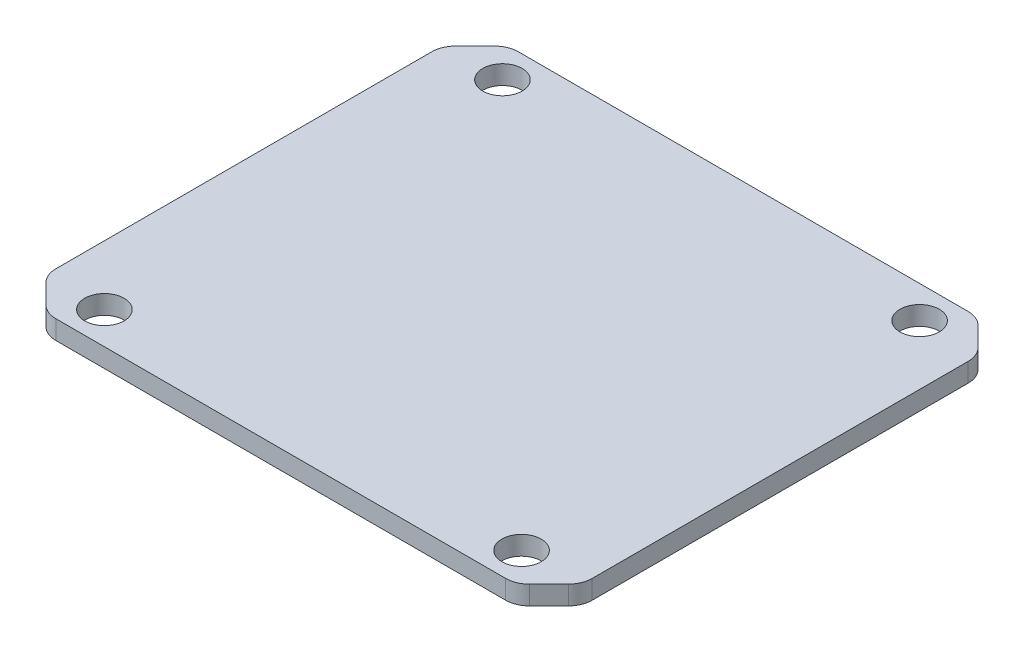
ISO-10303-21;
HEADER;
FILE_DESCRIPTION(('STEP AP214'),'2;1');
FILE_NAME('part.step','',(''),(''),'','','');
FILE_SCHEMA(('AUTOMOTIVE_DESIGN { 1 0 10303 214 1 1 1 1 }'));
ENDSEC;
DATA;
#1=APPLICATION_CONTEXT('core data for automotive mechanical design processes');
#2=APPLICATION_PROTOCOL_DEFINITION('international standard','automotive_design',2000,#1);
#3=PRODUCT_CONTEXT('',#1,'mechanical');
#4=PRODUCT('Part','Part','',(#3));
#5=PRODUCT_RELATED_PRODUCT_CATEGORY('part','',(#4));
#6=PRODUCT_DEFINITION_FORMATION('','',#4);
#7=PRODUCT_DEFINITION_CONTEXT('part definition',#1,'design');
#8=PRODUCT_DEFINITION('design','',#6,#7);
#9=PRODUCT_DEFINITION_SHAPE('','',#8);
#10=(LENGTH_UNIT() NAMED_UNIT(*) SI_UNIT(.MILLI.,.METRE.));
#11=(NAMED_UNIT(*) PLANE_ANGLE_UNIT() SI_UNIT($,.RADIAN.));
#12=(NAMED_UNIT(*) SI_UNIT($,.STERADIAN.) SOLID_ANGLE_UNIT());
#13=UNCERTAINTY_MEASURE_WITH_UNIT(LENGTH_MEASURE(1.E-05),#10,'distance_accuracy_value','');
#14=(GEOMETRIC_REPRESENTATION_CONTEXT(3) GLOBAL_UNCERTAINTY_ASSIGNED_CONTEXT((#13)) GLOBAL_UNIT_ASSIGNED_CONTEXT((#10,
#11,#12)) REPRESENTATION_CONTEXT('',''));
#15=CARTESIAN_POINT('',(0.,0.,0.));
#16=DIRECTION('',(0.,0.,1.));
#17=DIRECTION('',(1.,0.,0.));
#18=AXIS2_PLACEMENT_3D('',#15,#16,#17);
#19=CARTESIAN_POINT('',(22.5,0.79375,19.4));
#20=DIRECTION('',(-1.,0.,0.));
#21=DIRECTION('',(0.,0.,1.));
#22=AXIS2_PLACEMENT_3D('',#19,#20,#21);
#23=PLANE('',#22);
#24=DIRECTION('',(0.,0.,-1.));
#25=VECTOR('',#24,1.);
#26=CARTESIAN_POINT('',(22.5,-0.79375,19.4));
#27=LINE('',#26,#25);
#28=CARTESIAN_POINT('',(22.5,-0.79375,15.7715728752538));
#29=VERTEX_POINT('',#28);
#30=CARTESIAN_POINT('',(22.5,-0.79375,-15.7715728752538));
#31=VERTEX_POINT('',#30);
#32=EDGE_CURVE('E187',#29,#31,#27,.T.);
#33=ORIENTED_EDGE('',*,*,#32,.T.);
#34=DIRECTION('',(0.,-1.,0.));
#35=VECTOR('',#34,1.);
#36=CARTESIAN_POINT('',(22.5,0.79375,-15.7715728752538));
#37=LINE('',#36,#35);
#38=CARTESIAN_POINT('',(22.5,0.79375,-15.7715728752538));
#39=VERTEX_POINT('',#38);
#40=EDGE_CURVE('E253',#31,#39,#37,.F.);
#41=ORIENTED_EDGE('',*,*,#40,.T.);
#42=DIRECTION('',(0.,0.,-1.));
#43=VECTOR('',#42,1.);
#44=CARTESIAN_POINT('',(22.5,0.79375,19.4));
#45=LINE('',#44,#43);
#46=CARTESIAN_POINT('',(22.5,0.79375,15.7715728752538));
#47=VERTEX_POINT('',#46);
#48=EDGE_CURVE('E184',#47,#39,#45,.T.);
#49=ORIENTED_EDGE('',*,*,#48,.F.);
#50=DIRECTION('',(0.,1.,0.));
#51=VECTOR('',#50,1.);
#52=CARTESIAN_POINT('',(22.5,-0.79375,15.7715728752538));
#53=LINE('',#52,#51);
#54=EDGE_CURVE('E250',#47,#29,#53,.F.);
#55=ORIENTED_EDGE('',*,*,#54,.T.);
#56=EDGE_LOOP('',(#33,#41,#49,#55));
#57=FACE_BOUND('',#56,.T.);
#58=ADVANCED_FACE('F36',(#57),#23,.F.);
#59=CARTESIAN_POINT('',(-22.5,0.79375,-19.4));
#60=DIRECTION('',(0.,0.,1.));
#61=DIRECTION('',(1.,0.,0.));
#62=AXIS2_PLACEMENT_3D('',#59,#60,#61);
#63=PLANE('',#62);
#64=DIRECTION('',(-1.,0.,0.));
#65=VECTOR('',#64,1.);
#66=CARTESIAN_POINT('',(-22.5,-0.79375,-19.4));
#67=LINE('',#66,#65);
#68=CARTESIAN_POINT('',(18.8715728752538,-0.79375,-19.4));
#69=VERTEX_POINT('',#68);
#70=CARTESIAN_POINT('',(-18.8715728752538,-0.79375,-19.4));
#71=VERTEX_POINT('',#70);
#72=EDGE_CURVE('E181',#69,#71,#67,.T.);
#73=ORIENTED_EDGE('',*,*,#72,.T.);
#74=DIRECTION('',(0.,-1.,0.));
#75=VECTOR('',#74,1.);
#76=CARTESIAN_POINT('',(-18.8715728752538,0.79375,-19.4));
#77=LINE('',#76,#75);
#78=CARTESIAN_POINT('',(-18.8715728752538,0.79375,-19.4));
#79=VERTEX_POINT('',#78);
#80=EDGE_CURVE('E244',#71,#79,#77,.F.);
#81=ORIENTED_EDGE('',*,*,#80,.T.);
#82=DIRECTION('',(-1.,0.,0.));
#83=VECTOR('',#82,1.);
#84=CARTESIAN_POINT('',(-22.5,0.79375,-19.4));
#85=LINE('',#84,#83);
#86=CARTESIAN_POINT('',(18.8715728752538,0.79375,-19.4));
#87=VERTEX_POINT('',#86);
#88=EDGE_CURVE('E288',#87,#79,#85,.T.);
#89=ORIENTED_EDGE('',*,*,#88,.F.);
#90=DIRECTION('',(0.,1.,0.));
#91=VECTOR('',#90,1.);
#92=CARTESIAN_POINT('',(18.8715728752538,-0.79375,-19.4));
#93=LINE('',#92,#91);
#94=EDGE_CURVE('E241',#87,#69,#93,.F.);
#95=ORIENTED_EDGE('',*,*,#94,.T.);
#96=EDGE_LOOP('',(#73,#81,#89,#95));
#97=FACE_BOUND('',#96,.T.);
#98=ADVANCED_FACE('F310',(#97),#63,.F.);
#99=CARTESIAN_POINT('',(-22.5,0.79375,19.4));
#100=DIRECTION('',(1.,0.,0.));
#101=DIRECTION('',(0.,0.,-1.));
#102=AXIS2_PLACEMENT_3D('',#99,#100,#101);
#103=PLANE('',#102);
#104=DIRECTION('',(0.,0.,1.));
#105=VECTOR('',#104,1.);
#106=CARTESIAN_POINT('',(-22.5,0.79375,19.4));
#107=LINE('',#106,#105);
#108=CARTESIAN_POINT('',(-22.5,0.79375,-15.7715728752538));
#109=VERTEX_POINT('',#108);
#110=CARTESIAN_POINT('',(-22.5,0.79375,15.7715728752538));
#111=VERTEX_POINT('',#110);
#112=EDGE_CURVE('E172',#109,#111,#107,.T.);
#113=ORIENTED_EDGE('',*,*,#112,.F.);
#114=DIRECTION('',(0.,1.,0.));
#115=VECTOR('',#114,1.);
#116=CARTESIAN_POINT('',(-22.5,-0.79375,-15.7715728752538));
#117=LINE('',#116,#115);
#118=CARTESIAN_POINT('',(-22.5,-0.79375,-15.7715728752538));
#119=VERTEX_POINT('',#118);
#120=EDGE_CURVE('E155',#109,#119,#117,.F.);
#121=ORIENTED_EDGE('',*,*,#120,.T.);
#122=DIRECTION('',(0.,0.,1.));
#123=VECTOR('',#122,1.);
#124=CARTESIAN_POINT('',(-22.5,-0.79375,19.4));
#125=LINE('',#124,#123);
#126=CARTESIAN_POINT('',(-22.5,-0.79375,15.7715728752538));
#127=VERTEX_POINT('',#126);
#128=EDGE_CURVE('E169',#119,#127,#125,.T.);
#129=ORIENTED_EDGE('',*,*,#128,.T.);
#130=DIRECTION('',(0.,-1.,0.));
#131=VECTOR('',#130,1.);
#132=CARTESIAN_POINT('',(-22.5,0.79375,15.7715728752538));
#133=LINE('',#132,#131);
#134=EDGE_CURVE('E174',#127,#111,#133,.F.);
#135=ORIENTED_EDGE('',*,*,#134,.T.);
#136=EDGE_LOOP('',(#113,#121,#129,#135));
#137=FACE_BOUND('',#136,.T.);
#138=ADVANCED_FACE('F167',(#137),#103,.F.);
#139=CARTESIAN_POINT('',(-22.5,0.79375,19.4));
#140=DIRECTION('',(0.,0.,-1.));
#141=DIRECTION('',(-1.,0.,0.));
#142=AXIS2_PLACEMENT_3D('',#139,#140,#141);
#143=PLANE('',#142);
#144=DIRECTION('',(1.,0.,0.));
#145=VECTOR('',#144,1.);
#146=CARTESIAN_POINT('',(-22.5,-0.79375,19.4));
#147=LINE('',#146,#145);
#148=CARTESIAN_POINT('',(-18.8715728752538,-0.79375,19.4));
#149=VERTEX_POINT('',#148);
#150=CARTESIAN_POINT('',(18.8715728752538,-0.79375,19.4));
#151=VERTEX_POINT('',#150);
#152=EDGE_CURVE('E180',#149,#151,#147,.T.);
#153=ORIENTED_EDGE('',*,*,#152,.T.);
#154=DIRECTION('',(0.,-1.,0.));
#155=VECTOR('',#154,1.);
#156=CARTESIAN_POINT('',(18.8715728752538,0.79375,19.4));
#157=LINE('',#156,#155);
#158=CARTESIAN_POINT('',(18.8715728752538,0.79375,19.4));
#159=VERTEX_POINT('',#158);
#160=EDGE_CURVE('E263',#151,#159,#157,.F.);
#161=ORIENTED_EDGE('',*,*,#160,.T.);
#162=DIRECTION('',(1.,0.,0.));
#163=VECTOR('',#162,1.);
#164=CARTESIAN_POINT('',(-22.5,0.79375,19.4));
#165=LINE('',#164,#163);
#166=CARTESIAN_POINT('',(-18.8715728752538,0.79375,19.4));
#167=VERTEX_POINT('',#166);
#168=EDGE_CURVE('E195',#167,#159,#165,.T.);
#169=ORIENTED_EDGE('',*,*,#168,.F.);
#170=DIRECTION('',(0.,1.,0.));
#171=VECTOR('',#170,1.);
#172=CARTESIAN_POINT('',(-18.8715728752538,-0.79375,19.4));
#173=LINE('',#172,#171);
#174=EDGE_CURVE('E260',#167,#149,#173,.F.);
#175=ORIENTED_EDGE('',*,*,#174,.T.);
#176=EDGE_LOOP('',(#153,#161,#169,#175));
#177=FACE_BOUND('',#176,.T.);
#178=ADVANCED_FACE('F279',(#177),#143,.F.);
#179=CARTESIAN_POINT('',(0.,0.79375,0.));
#180=DIRECTION('',(0.,-1.,0.));
#181=DIRECTION('',(0.,0.,-1.));
#182=AXIS2_PLACEMENT_3D('',#179,#180,#181);
#183=PLANE('',#182);
#184=CARTESIAN_POINT('',(-17.5,0.79375,16.7));
#185=DIRECTION('',(0.,-1.,0.));
#186=DIRECTION('',(0.,0.,-1.));
#187=AXIS2_PLACEMENT_3D('',#184,#185,#186);
#188=CIRCLE('',#187,1.65);
#189=CARTESIAN_POINT('',(-17.5,0.79375,15.05));
#190=VERTEX_POINT('',#189);
#191=EDGE_CURVE('E292',#190,#190,#188,.T.);
#192=ORIENTED_EDGE('',*,*,#191,.T.);
#193=EDGE_LOOP('',(#192));
#194=FACE_BOUND('',#193,.T.);
#195=CARTESIAN_POINT('',(17.5,0.79375,16.7));
#196=DIRECTION('',(0.,-1.,0.));
#197=DIRECTION('',(0.,0.,-1.));
#198=AXIS2_PLACEMENT_3D('',#195,#196,#197);
#199=CIRCLE('',#198,1.65);
#200=CARTESIAN_POINT('',(17.5,0.79375,15.05));
#201=VERTEX_POINT('',#200);
#202=EDGE_CURVE('E297',#201,#201,#199,.T.);
#203=ORIENTED_EDGE('',*,*,#202,.T.);
#204=EDGE_LOOP('',(#203));
#205=FACE_BOUND('',#204,.T.);
#206=CARTESIAN_POINT('',(17.5,0.79375,-16.7));
#207=DIRECTION('',(0.,-1.,0.));
#208=DIRECTION('',(0.,0.,-1.));
#209=AXIS2_PLACEMENT_3D('',#206,#207,#208);
#210=CIRCLE('',#209,1.65);
#211=CARTESIAN_POINT('',(17.5,0.79375,-18.35));
#212=VERTEX_POINT('',#211);
#213=EDGE_CURVE('E302',#212,#212,#210,.T.);
#214=ORIENTED_EDGE('',*,*,#213,.T.);
#215=EDGE_LOOP('',(#214));
#216=FACE_BOUND('',#215,.T.);
#217=CARTESIAN_POINT('',(-17.5,0.79375,-16.7));
#218=DIRECTION('',(0.,-1.,0.));
#219=DIRECTION('',(0.,0.,-1.));
#220=AXIS2_PLACEMENT_3D('',#217,#218,#219);
#221=CIRCLE('',#220,1.65);
#222=CARTESIAN_POINT('',(-17.5,0.79375,-18.35));
#223=VERTEX_POINT('',#222);
#224=EDGE_CURVE('E538',#223,#223,#221,.T.);
#225=ORIENTED_EDGE('',*,*,#224,.T.);
#226=EDGE_LOOP('',(#225));
#227=FACE_BOUND('',#226,.T.);
#228=DIRECTION('',(0.707106781186548,0.,-0.707106781186547));
#229=VECTOR('',#228,1.);
#230=CARTESIAN_POINT('',(-22.5,0.79375,-16.6));
#231=LINE('',#230,#229);
#232=CARTESIAN_POINT('',(-20.2857864376269,0.79375,-18.8142135623731));
#233=VERTEX_POINT('',#232);
#234=CARTESIAN_POINT('',(-21.9142135623731,0.79375,-17.1857864376269));
#235=VERTEX_POINT('',#234);
#236=EDGE_CURVE('E207',#233,#235,#231,.F.);
#237=ORIENTED_EDGE('',*,*,#236,.T.);
#238=CARTESIAN_POINT('',(-20.5,0.79375,-15.7715728752538));
#239=DIRECTION('',(0.,-1.,0.));
#240=DIRECTION('',(0.,0.,-1.));
#241=AXIS2_PLACEMENT_3D('',#238,#239,#240);
#242=CIRCLE('',#241,2.);
#243=EDGE_CURVE('E239',#235,#109,#242,.F.);
#244=ORIENTED_EDGE('',*,*,#243,.T.);
#245=ORIENTED_EDGE('',*,*,#112,.T.);
#246=CARTESIAN_POINT('',(-20.5,0.79375,15.7715728752538));
#247=DIRECTION('',(0.,-1.,0.));
#248=DIRECTION('',(0.,0.,-1.));
#249=AXIS2_PLACEMENT_3D('',#246,#247,#248);
#250=CIRCLE('',#249,2.);
#251=CARTESIAN_POINT('',(-21.9142135623731,0.79375,17.1857864376269));
#252=VERTEX_POINT('',#251);
#253=EDGE_CURVE('E229',#111,#252,#250,.F.);
#254=ORIENTED_EDGE('',*,*,#253,.T.);
#255=DIRECTION('',(-0.707106781186547,0.,-0.707106781186548));
#256=VECTOR('',#255,1.);
#257=CARTESIAN_POINT('',(-19.7,0.79375,19.4));
#258=LINE('',#257,#256);
#259=CARTESIAN_POINT('',(-20.2857864376269,0.79375,18.8142135623731));
#260=VERTEX_POINT('',#259);
#261=EDGE_CURVE('E210',#252,#260,#258,.F.);
#262=ORIENTED_EDGE('',*,*,#261,.T.);
#263=CARTESIAN_POINT('',(-18.8715728752538,0.79375,17.4));
#264=DIRECTION('',(0.,-1.,0.));
#265=DIRECTION('',(0.,0.,-1.));
#266=AXIS2_PLACEMENT_3D('',#263,#264,#265);
#267=CIRCLE('',#266,2.);
#268=EDGE_CURVE('E227',#260,#167,#267,.F.);
#269=ORIENTED_EDGE('',*,*,#268,.T.);
#270=ORIENTED_EDGE('',*,*,#168,.T.);
#271=CARTESIAN_POINT('',(18.8715728752538,0.79375,17.4));
#272=DIRECTION('',(0.,-1.,0.));
#273=DIRECTION('',(0.,0.,-1.));
#274=AXIS2_PLACEMENT_3D('',#271,#272,#273);
#275=CIRCLE('',#274,2.);
#276=CARTESIAN_POINT('',(20.2857864376269,0.79375,18.8142135623731));
#277=VERTEX_POINT('',#276);
#278=EDGE_CURVE('E231',#159,#277,#275,.F.);
#279=ORIENTED_EDGE('',*,*,#278,.T.);
#280=DIRECTION('',(-0.707106781186548,0.,0.707106781186547));
#281=VECTOR('',#280,1.);
#282=CARTESIAN_POINT('',(22.5,0.79375,16.6));
#283=LINE('',#282,#281);
#284=CARTESIAN_POINT('',(21.9142135623731,0.79375,17.1857864376269));
#285=VERTEX_POINT('',#284);
#286=EDGE_CURVE('E202',#277,#285,#283,.F.);
#287=ORIENTED_EDGE('',*,*,#286,.T.);
#288=CARTESIAN_POINT('',(20.5,0.79375,15.7715728752538));
#289=DIRECTION('',(0.,-1.,0.));
#290=DIRECTION('',(0.,0.,-1.));
#291=AXIS2_PLACEMENT_3D('',#288,#289,#290);
#292=CIRCLE('',#291,2.);
#293=EDGE_CURVE('E233',#285,#47,#292,.F.);
#294=ORIENTED_EDGE('',*,*,#293,.T.);
#295=ORIENTED_EDGE('',*,*,#48,.T.);
#296=CARTESIAN_POINT('',(20.5,0.79375,-15.7715728752538));
#297=DIRECTION('',(0.,-1.,0.));
#298=DIRECTION('',(0.,0.,-1.));
#299=AXIS2_PLACEMENT_3D('',#296,#297,#298);
#300=CIRCLE('',#299,2.);
#301=CARTESIAN_POINT('',(21.9142135623731,0.79375,-17.1857864376269));
#302=VERTEX_POINT('',#301);
#303=EDGE_CURVE('E235',#39,#302,#300,.F.);
#304=ORIENTED_EDGE('',*,*,#303,.T.);
#305=DIRECTION('',(0.707106781186547,0.,0.707106781186548));
#306=VECTOR('',#305,1.);
#307=CARTESIAN_POINT('',(19.7,0.79375,-19.4));
#308=LINE('',#307,#306);
#309=CARTESIAN_POINT('',(20.2857864376269,0.79375,-18.8142135623731));
#310=VERTEX_POINT('',#309);
#311=EDGE_CURVE('E205',#302,#310,#308,.F.);
#312=ORIENTED_EDGE('',*,*,#311,.T.);
#313=CARTESIAN_POINT('',(18.8715728752538,0.79375,-17.4));
#314=DIRECTION('',(0.,-1.,0.));
#315=DIRECTION('',(0.,0.,-1.));
#316=AXIS2_PLACEMENT_3D('',#313,#314,#315);
#317=CIRCLE('',#316,2.);
#318=EDGE_CURVE('E59',#310,#87,#317,.F.);
#319=ORIENTED_EDGE('',*,*,#318,.T.);
#320=ORIENTED_EDGE('',*,*,#88,.T.);
#321=CARTESIAN_POINT('',(-18.8715728752538,0.79375,-17.4));
#322=DIRECTION('',(0.,-1.,0.));
#323=DIRECTION('',(0.,0.,-1.));
#324=AXIS2_PLACEMENT_3D('',#321,#322,#323);
#325=CIRCLE('',#324,2.);
#326=EDGE_CURVE('E51',#79,#233,#325,.F.);
#327=ORIENTED_EDGE('',*,*,#326,.T.);
#328=EDGE_LOOP('',(#237,#244,#245,#254,#262,#269,#270,#279,#287,#294,#295,#304,#312,#319,#320,#327));
#329=FACE_BOUND('',#328,.T.);
#330=ADVANCED_FACE('F273',(#194,#205,#216,#227,#329),#183,.F.);
#331=CARTESIAN_POINT('',(0.,-0.79375,0.));
#332=DIRECTION('',(0.,-1.,0.));
#333=DIRECTION('',(0.,0.,-1.));
#334=AXIS2_PLACEMENT_3D('',#331,#332,#333);
#335=PLANE('',#334);
#336=CARTESIAN_POINT('',(-17.5,-0.79375,16.7));
#337=DIRECTION('',(0.,1.,0.));
#338=DIRECTION('',(0.,0.,1.));
#339=AXIS2_PLACEMENT_3D('',#336,#337,#338);
#340=CIRCLE('',#339,1.65);
#341=CARTESIAN_POINT('',(-17.5,-0.79375,18.35));
#342=VERTEX_POINT('',#341);
#343=EDGE_CURVE('E545',#342,#342,#340,.T.);
#344=ORIENTED_EDGE('',*,*,#343,.T.);
#345=EDGE_LOOP('',(#344));
#346=FACE_BOUND('',#345,.T.);
#347=CARTESIAN_POINT('',(17.5,-0.79375,16.7));
#348=DIRECTION('',(0.,1.,0.));
#349=DIRECTION('',(0.,0.,1.));
#350=AXIS2_PLACEMENT_3D('',#347,#348,#349);
#351=CIRCLE('',#350,1.65);
#352=CARTESIAN_POINT('',(17.5,-0.79375,18.35));
#353=VERTEX_POINT('',#352);
#354=EDGE_CURVE('E548',#353,#353,#351,.T.);
#355=ORIENTED_EDGE('',*,*,#354,.T.);
#356=EDGE_LOOP('',(#355));
#357=FACE_BOUND('',#356,.T.);
#358=CARTESIAN_POINT('',(17.5,-0.79375,-16.7));
#359=DIRECTION('',(0.,1.,0.));
#360=DIRECTION('',(0.,0.,1.));
#361=AXIS2_PLACEMENT_3D('',#358,#359,#360);
#362=CIRCLE('',#361,1.65);
#363=CARTESIAN_POINT('',(17.5,-0.79375,-15.05));
#364=VERTEX_POINT('',#363);
#365=EDGE_CURVE('E542',#364,#364,#362,.T.);
#366=ORIENTED_EDGE('',*,*,#365,.T.);
#367=EDGE_LOOP('',(#366));
#368=FACE_BOUND('',#367,.T.);
#369=CARTESIAN_POINT('',(-17.5,-0.79375,-16.7));
#370=DIRECTION('',(0.,1.,0.));
#371=DIRECTION('',(0.,0.,1.));
#372=AXIS2_PLACEMENT_3D('',#369,#370,#371);
#373=CIRCLE('',#372,1.65);
#374=CARTESIAN_POINT('',(-17.5,-0.79375,-15.05));
#375=VERTEX_POINT('',#374);
#376=EDGE_CURVE('E535',#375,#375,#373,.T.);
#377=ORIENTED_EDGE('',*,*,#376,.T.);
#378=EDGE_LOOP('',(#377));
#379=FACE_BOUND('',#378,.T.);
#380=ORIENTED_EDGE('',*,*,#128,.F.);
#381=CARTESIAN_POINT('',(-20.5,-0.79375,-15.7715728752538));
#382=DIRECTION('',(0.,-1.,0.));
#383=DIRECTION('',(0.,0.,-1.));
#384=AXIS2_PLACEMENT_3D('',#381,#382,#383);
#385=CIRCLE('',#384,2.);
#386=CARTESIAN_POINT('',(-21.9142135623731,-0.79375,-17.1857864376269));
#387=VERTEX_POINT('',#386);
#388=EDGE_CURVE('E151',#119,#387,#385,.T.);
#389=ORIENTED_EDGE('',*,*,#388,.T.);
#390=DIRECTION('',(-0.707106781186548,0.,0.707106781186547));
#391=VECTOR('',#390,1.);
#392=CARTESIAN_POINT('',(-19.55,-0.79375,-19.55));
#393=LINE('',#392,#391);
#394=CARTESIAN_POINT('',(-20.2857864376269,-0.79375,-18.8142135623731));
#395=VERTEX_POINT('',#394);
#396=EDGE_CURVE('E198',#387,#395,#393,.F.);
#397=ORIENTED_EDGE('',*,*,#396,.T.);
#398=CARTESIAN_POINT('',(-18.8715728752538,-0.79375,-17.4));
#399=DIRECTION('',(0.,-1.,0.));
#400=DIRECTION('',(0.,0.,-1.));
#401=AXIS2_PLACEMENT_3D('',#398,#399,#400);
#402=CIRCLE('',#401,2.);
#403=EDGE_CURVE('E162',#395,#71,#402,.T.);
#404=ORIENTED_EDGE('',*,*,#403,.T.);
#405=ORIENTED_EDGE('',*,*,#72,.F.);
#406=CARTESIAN_POINT('',(18.8715728752538,-0.79375,-17.4));
#407=DIRECTION('',(0.,-1.,0.));
#408=DIRECTION('',(0.,0.,-1.));
#409=AXIS2_PLACEMENT_3D('',#406,#407,#408);
#410=CIRCLE('',#409,2.);
#411=CARTESIAN_POINT('',(20.2857864376269,-0.79375,-18.8142135623731));
#412=VERTEX_POINT('',#411);
#413=EDGE_CURVE('E222',#69,#412,#410,.T.);
#414=ORIENTED_EDGE('',*,*,#413,.T.);
#415=DIRECTION('',(-0.707106781186547,0.,-0.707106781186548));
#416=VECTOR('',#415,1.);
#417=CARTESIAN_POINT('',(19.55,-0.79375,-19.55));
#418=LINE('',#417,#416);
#419=CARTESIAN_POINT('',(21.9142135623731,-0.79375,-17.1857864376269));
#420=VERTEX_POINT('',#419);
#421=EDGE_CURVE('E194',#412,#420,#418,.F.);
#422=ORIENTED_EDGE('',*,*,#421,.T.);
#423=CARTESIAN_POINT('',(20.5,-0.79375,-15.7715728752538));
#424=DIRECTION('',(0.,-1.,0.));
#425=DIRECTION('',(0.,0.,-1.));
#426=AXIS2_PLACEMENT_3D('',#423,#424,#425);
#427=CIRCLE('',#426,2.);
#428=EDGE_CURVE('E220',#420,#31,#427,.T.);
#429=ORIENTED_EDGE('',*,*,#428,.T.);
#430=ORIENTED_EDGE('',*,*,#32,.F.);
#431=CARTESIAN_POINT('',(20.5,-0.79375,15.7715728752538));
#432=DIRECTION('',(0.,-1.,0.));
#433=DIRECTION('',(0.,0.,-1.));
#434=AXIS2_PLACEMENT_3D('',#431,#432,#433);
#435=CIRCLE('',#434,2.);
#436=CARTESIAN_POINT('',(21.9142135623731,-0.79375,17.1857864376269));
#437=VERTEX_POINT('',#436);
#438=EDGE_CURVE('E218',#29,#437,#435,.T.);
#439=ORIENTED_EDGE('',*,*,#438,.T.);
#440=DIRECTION('',(0.707106781186548,0.,-0.707106781186547));
#441=VECTOR('',#440,1.);
#442=CARTESIAN_POINT('',(19.55,-0.79375,19.55));
#443=LINE('',#442,#441);
#444=CARTESIAN_POINT('',(20.2857864376269,-0.79375,18.8142135623731));
#445=VERTEX_POINT('',#444);
#446=EDGE_CURVE('E191',#437,#445,#443,.F.);
#447=ORIENTED_EDGE('',*,*,#446,.T.);
#448=CARTESIAN_POINT('',(18.8715728752538,-0.79375,17.4));
#449=DIRECTION('',(0.,-1.,0.));
#450=DIRECTION('',(0.,0.,-1.));
#451=AXIS2_PLACEMENT_3D('',#448,#449,#450);
#452=CIRCLE('',#451,2.);
#453=EDGE_CURVE('E216',#445,#151,#452,.T.);
#454=ORIENTED_EDGE('',*,*,#453,.T.);
#455=ORIENTED_EDGE('',*,*,#152,.F.);
#456=CARTESIAN_POINT('',(-18.8715728752538,-0.79375,17.4));
#457=DIRECTION('',(0.,-1.,0.));
#458=DIRECTION('',(0.,0.,-1.));
#459=AXIS2_PLACEMENT_3D('',#456,#457,#458);
#460=CIRCLE('',#459,2.);
#461=CARTESIAN_POINT('',(-20.2857864376269,-0.79375,18.8142135623731));
#462=VERTEX_POINT('',#461);
#463=EDGE_CURVE('E173',#149,#462,#460,.T.);
#464=ORIENTED_EDGE('',*,*,#463,.T.);
#465=DIRECTION('',(0.707106781186547,0.,0.707106781186548));
#466=VECTOR('',#465,1.);
#467=CARTESIAN_POINT('',(-19.55,-0.79375,19.55));
#468=LINE('',#467,#466);
#469=CARTESIAN_POINT('',(-21.9142135623731,-0.79375,17.1857864376269));
#470=VERTEX_POINT('',#469);
#471=EDGE_CURVE('E200',#462,#470,#468,.F.);
#472=ORIENTED_EDGE('',*,*,#471,.T.);
#473=CARTESIAN_POINT('',(-20.5,-0.79375,15.7715728752538));
#474=DIRECTION('',(0.,-1.,0.));
#475=DIRECTION('',(0.,0.,-1.));
#476=AXIS2_PLACEMENT_3D('',#473,#474,#475);
#477=CIRCLE('',#476,2.);
#478=EDGE_CURVE('E179',#470,#127,#477,.T.);
#479=ORIENTED_EDGE('',*,*,#478,.T.);
#480=EDGE_LOOP('',(#380,#389,#397,#404,#405,#414,#422,#429,#430,#439,#447,#454,#455,#464,#472,#479));
#481=FACE_BOUND('',#480,.T.);
#482=ADVANCED_FACE('F176',(#346,#357,#368,#379,#481),#335,.T.);
#483=CARTESIAN_POINT('',(-17.5,-0.79375,-16.7));
#484=DIRECTION('',(0.,1.,0.));
#485=DIRECTION('',(0.,0.,1.));
#486=AXIS2_PLACEMENT_3D('',#483,#484,#485);
#487=CYLINDRICAL_SURFACE('',#486,1.65);
#488=ORIENTED_EDGE('',*,*,#376,.F.);
#489=EDGE_LOOP('',(#488));
#490=FACE_BOUND('',#489,.T.);
#491=ORIENTED_EDGE('',*,*,#224,.F.);
#492=EDGE_LOOP('',(#491));
#493=FACE_BOUND('',#492,.T.);
#494=ADVANCED_FACE('F458',(#490,#493),#487,.F.);
#495=CARTESIAN_POINT('',(17.5,-0.79375,-16.7));
#496=DIRECTION('',(0.,1.,0.));
#497=DIRECTION('',(0.,0.,1.));
#498=AXIS2_PLACEMENT_3D('',#495,#496,#497);
#499=CYLINDRICAL_SURFACE('',#498,1.65);
#500=ORIENTED_EDGE('',*,*,#365,.F.);
#501=EDGE_LOOP('',(#500));
#502=FACE_BOUND('',#501,.T.);
#503=ORIENTED_EDGE('',*,*,#213,.F.);
#504=EDGE_LOOP('',(#503));
#505=FACE_BOUND('',#504,.T.);
#506=ADVANCED_FACE('F511',(#502,#505),#499,.F.);
#507=CARTESIAN_POINT('',(17.5,-0.79375,16.7));
#508=DIRECTION('',(0.,1.,0.));
#509=DIRECTION('',(0.,0.,1.));
#510=AXIS2_PLACEMENT_3D('',#507,#508,#509);
#511=CYLINDRICAL_SURFACE('',#510,1.65);
#512=ORIENTED_EDGE('',*,*,#354,.F.);
#513=EDGE_LOOP('',(#512));
#514=FACE_BOUND('',#513,.T.);
#515=ORIENTED_EDGE('',*,*,#202,.F.);
#516=EDGE_LOOP('',(#515));
#517=FACE_BOUND('',#516,.T.);
#518=ADVANCED_FACE('F501',(#514,#517),#511,.F.);
#519=CARTESIAN_POINT('',(-17.5,-0.79375,16.7));
#520=DIRECTION('',(0.,1.,0.));
#521=DIRECTION('',(0.,0.,1.));
#522=AXIS2_PLACEMENT_3D('',#519,#520,#521);
#523=CYLINDRICAL_SURFACE('',#522,1.65);
#524=ORIENTED_EDGE('',*,*,#343,.F.);
#525=EDGE_LOOP('',(#524));
#526=FACE_BOUND('',#525,.T.);
#527=ORIENTED_EDGE('',*,*,#191,.F.);
#528=EDGE_LOOP('',(#527));
#529=FACE_BOUND('',#528,.T.);
#530=ADVANCED_FACE('F346',(#526,#529),#523,.F.);
#531=CARTESIAN_POINT('',(-19.7,0.79375,19.4));
#532=DIRECTION('',(0.707106781186548,0.,-0.707106781186547));
#533=DIRECTION('',(0.,-1.,0.));
#534=AXIS2_PLACEMENT_3D('',#531,#532,#533);
#535=PLANE('',#534);
#536=ORIENTED_EDGE('',*,*,#261,.F.);
#537=DIRECTION('',(0.,1.,0.));
#538=VECTOR('',#537,1.);
#539=CARTESIAN_POINT('',(-21.9142135623731,-0.79375,17.1857864376269));
#540=LINE('',#539,#538);
#541=EDGE_CURVE('E11',#252,#470,#540,.F.);
#542=ORIENTED_EDGE('',*,*,#541,.T.);
#543=ORIENTED_EDGE('',*,*,#471,.F.);
#544=DIRECTION('',(0.,-1.,0.));
#545=VECTOR('',#544,1.);
#546=CARTESIAN_POINT('',(-20.2857864376269,0.79375,18.8142135623731));
#547=LINE('',#546,#545);
#548=EDGE_CURVE('E44',#462,#260,#547,.F.);
#549=ORIENTED_EDGE('',*,*,#548,.T.);
#550=EDGE_LOOP('',(#536,#542,#543,#549));
#551=FACE_BOUND('',#550,.T.);
#552=ADVANCED_FACE('F269',(#551),#535,.F.);
#553=CARTESIAN_POINT('',(-22.5,0.79375,-16.6));
#554=DIRECTION('',(0.707106781186547,0.,0.707106781186549));
#555=DIRECTION('',(0.,-1.,0.));
#556=AXIS2_PLACEMENT_3D('',#553,#554,#555);
#557=PLANE('',#556);
#558=ORIENTED_EDGE('',*,*,#396,.F.);
#559=DIRECTION('',(0.,-1.,0.));
#560=VECTOR('',#559,1.);
#561=CARTESIAN_POINT('',(-21.9142135623731,0.79375,-17.1857864376269));
#562=LINE('',#561,#560);
#563=EDGE_CURVE('E156',#387,#235,#562,.F.);
#564=ORIENTED_EDGE('',*,*,#563,.T.);
#565=ORIENTED_EDGE('',*,*,#236,.F.);
#566=DIRECTION('',(0.,1.,0.));
#567=VECTOR('',#566,1.);
#568=CARTESIAN_POINT('',(-20.2857864376269,-0.79375,-18.8142135623731));
#569=LINE('',#568,#567);
#570=EDGE_CURVE('E161',#233,#395,#569,.F.);
#571=ORIENTED_EDGE('',*,*,#570,.T.);
#572=EDGE_LOOP('',(#558,#564,#565,#571));
#573=FACE_BOUND('',#572,.T.);
#574=ADVANCED_FACE('F345',(#573),#557,.F.);
#575=CARTESIAN_POINT('',(19.7,0.79375,-19.4));
#576=DIRECTION('',(-0.707106781186548,0.,0.707106781186547));
#577=DIRECTION('',(0.,-1.,0.));
#578=AXIS2_PLACEMENT_3D('',#575,#576,#577);
#579=PLANE('',#578);
#580=ORIENTED_EDGE('',*,*,#421,.F.);
#581=DIRECTION('',(0.,-1.,0.));
#582=VECTOR('',#581,1.);
#583=CARTESIAN_POINT('',(20.2857864376269,0.79375,-18.8142135623731));
#584=LINE('',#583,#582);
#585=EDGE_CURVE('E248',#412,#310,#584,.F.);
#586=ORIENTED_EDGE('',*,*,#585,.T.);
#587=ORIENTED_EDGE('',*,*,#311,.F.);
#588=DIRECTION('',(0.,1.,0.));
#589=VECTOR('',#588,1.);
#590=CARTESIAN_POINT('',(21.9142135623731,-0.79375,-17.1857864376269));
#591=LINE('',#590,#589);
#592=EDGE_CURVE('E246',#302,#420,#591,.F.);
#593=ORIENTED_EDGE('',*,*,#592,.T.);
#594=EDGE_LOOP('',(#580,#586,#587,#593));
#595=FACE_BOUND('',#594,.T.);
#596=ADVANCED_FACE('F318',(#595),#579,.F.);
#597=CARTESIAN_POINT('',(22.5,0.79375,16.6));
#598=DIRECTION('',(-0.707106781186547,0.,-0.707106781186548));
#599=DIRECTION('',(0.,-1.,0.));
#600=AXIS2_PLACEMENT_3D('',#597,#598,#599);
#601=PLANE('',#600);
#602=ORIENTED_EDGE('',*,*,#446,.F.);
#603=DIRECTION('',(0.,-1.,0.));
#604=VECTOR('',#603,1.);
#605=CARTESIAN_POINT('',(21.9142135623731,0.79375,17.1857864376269));
#606=LINE('',#605,#604);
#607=EDGE_CURVE('E258',#437,#285,#606,.F.);
#608=ORIENTED_EDGE('',*,*,#607,.T.);
#609=ORIENTED_EDGE('',*,*,#286,.F.);
#610=DIRECTION('',(0.,1.,0.));
#611=VECTOR('',#610,1.);
#612=CARTESIAN_POINT('',(20.2857864376269,-0.79375,18.8142135623731));
#613=LINE('',#612,#611);
#614=EDGE_CURVE('E256',#277,#445,#613,.F.);
#615=ORIENTED_EDGE('',*,*,#614,.T.);
#616=EDGE_LOOP('',(#602,#608,#609,#615));
#617=FACE_BOUND('',#616,.T.);
#618=ADVANCED_FACE('F327',(#617),#601,.F.);
#619=CARTESIAN_POINT('',(-20.5,0.79375,-15.7715728752538));
#620=DIRECTION('',(0.,-1.,0.));
#621=DIRECTION('',(0.,0.,-1.));
#622=AXIS2_PLACEMENT_3D('',#619,#620,#621);
#623=CYLINDRICAL_SURFACE('',#622,2.);
#624=ORIENTED_EDGE('',*,*,#243,.F.);
#625=ORIENTED_EDGE('',*,*,#563,.F.);
#626=ORIENTED_EDGE('',*,*,#388,.F.);
#627=ORIENTED_EDGE('',*,*,#120,.F.);
#628=EDGE_LOOP('',(#624,#625,#626,#627));
#629=FACE_BOUND('',#628,.T.);
#630=ADVANCED_FACE('F154',(#629),#623,.T.);
#631=CARTESIAN_POINT('',(-18.8715728752538,0.79375,-17.4));
#632=DIRECTION('',(0.,1.,0.));
#633=DIRECTION('',(0.,0.,1.));
#634=AXIS2_PLACEMENT_3D('',#631,#632,#633);
#635=CYLINDRICAL_SURFACE('',#634,2.);
#636=ORIENTED_EDGE('',*,*,#403,.F.);
#637=ORIENTED_EDGE('',*,*,#570,.F.);
#638=ORIENTED_EDGE('',*,*,#326,.F.);
#639=ORIENTED_EDGE('',*,*,#80,.F.);
#640=EDGE_LOOP('',(#636,#637,#638,#639));
#641=FACE_BOUND('',#640,.T.);
#642=ADVANCED_FACE('F364',(#641),#635,.T.);
#643=CARTESIAN_POINT('',(18.8715728752538,0.79375,-17.4));
#644=DIRECTION('',(0.,-1.,0.));
#645=DIRECTION('',(0.,0.,-1.));
#646=AXIS2_PLACEMENT_3D('',#643,#644,#645);
#647=CYLINDRICAL_SURFACE('',#646,2.);
#648=ORIENTED_EDGE('',*,*,#318,.F.);
#649=ORIENTED_EDGE('',*,*,#585,.F.);
#650=ORIENTED_EDGE('',*,*,#413,.F.);
#651=ORIENTED_EDGE('',*,*,#94,.F.);
#652=EDGE_LOOP('',(#648,#649,#650,#651));
#653=FACE_BOUND('',#652,.T.);
#654=ADVANCED_FACE('F313',(#653),#647,.T.);
#655=CARTESIAN_POINT('',(20.5,0.79375,-15.7715728752538));
#656=DIRECTION('',(0.,1.,0.));
#657=DIRECTION('',(0.,0.,1.));
#658=AXIS2_PLACEMENT_3D('',#655,#656,#657);
#659=CYLINDRICAL_SURFACE('',#658,2.);
#660=ORIENTED_EDGE('',*,*,#428,.F.);
#661=ORIENTED_EDGE('',*,*,#592,.F.);
#662=ORIENTED_EDGE('',*,*,#303,.F.);
#663=ORIENTED_EDGE('',*,*,#40,.F.);
#664=EDGE_LOOP('',(#660,#661,#662,#663));
#665=FACE_BOUND('',#664,.T.);
#666=ADVANCED_FACE('F322',(#665),#659,.T.);
#667=CARTESIAN_POINT('',(20.5,0.79375,15.7715728752538));
#668=DIRECTION('',(0.,-1.,0.));
#669=DIRECTION('',(0.,0.,-1.));
#670=AXIS2_PLACEMENT_3D('',#667,#668,#669);
#671=CYLINDRICAL_SURFACE('',#670,2.);
#672=ORIENTED_EDGE('',*,*,#293,.F.);
#673=ORIENTED_EDGE('',*,*,#607,.F.);
#674=ORIENTED_EDGE('',*,*,#438,.F.);
#675=ORIENTED_EDGE('',*,*,#54,.F.);
#676=EDGE_LOOP('',(#672,#673,#674,#675));
#677=FACE_BOUND('',#676,.T.);
#678=ADVANCED_FACE('F329',(#677),#671,.T.);
#679=CARTESIAN_POINT('',(18.8715728752538,0.79375,17.4));
#680=DIRECTION('',(0.,1.,0.));
#681=DIRECTION('',(0.,0.,1.));
#682=AXIS2_PLACEMENT_3D('',#679,#680,#681);
#683=CYLINDRICAL_SURFACE('',#682,2.);
#684=ORIENTED_EDGE('',*,*,#453,.F.);
#685=ORIENTED_EDGE('',*,*,#614,.F.);
#686=ORIENTED_EDGE('',*,*,#278,.F.);
#687=ORIENTED_EDGE('',*,*,#160,.F.);
#688=EDGE_LOOP('',(#684,#685,#686,#687));
#689=FACE_BOUND('',#688,.T.);
#690=ADVANCED_FACE('F285',(#689),#683,.T.);
#691=CARTESIAN_POINT('',(-20.5,0.79375,15.7715728752538));
#692=DIRECTION('',(0.,1.,0.));
#693=DIRECTION('',(0.,0.,1.));
#694=AXIS2_PLACEMENT_3D('',#691,#692,#693);
#695=CYLINDRICAL_SURFACE('',#694,2.);
#696=ORIENTED_EDGE('',*,*,#478,.F.);
#697=ORIENTED_EDGE('',*,*,#541,.F.);
#698=ORIENTED_EDGE('',*,*,#253,.F.);
#699=ORIENTED_EDGE('',*,*,#134,.F.);
#700=EDGE_LOOP('',(#696,#697,#698,#699));
#701=FACE_BOUND('',#700,.T.);
#702=ADVANCED_FACE('F374',(#701),#695,.T.);
#703=CARTESIAN_POINT('',(-18.8715728752538,0.79375,17.4));
#704=DIRECTION('',(0.,-1.,0.));
#705=DIRECTION('',(0.,0.,-1.));
#706=AXIS2_PLACEMENT_3D('',#703,#704,#705);
#707=CYLINDRICAL_SURFACE('',#706,2.);
#708=ORIENTED_EDGE('',*,*,#268,.F.);
#709=ORIENTED_EDGE('',*,*,#548,.F.);
#710=ORIENTED_EDGE('',*,*,#463,.F.);
#711=ORIENTED_EDGE('',*,*,#174,.F.);
#712=EDGE_LOOP('',(#708,#709,#710,#711));
#713=FACE_BOUND('',#712,.T.);
#714=ADVANCED_FACE('F38',(#713),#707,.T.);
#715=CLOSED_SHELL('',(#58,#98,#138,#178,#330,#482,#494,#506,#518,#530,#552,#574,#596,#618,#630,
#642,#654,#666,#678,#690,#702,#714));
#716=MANIFOLD_SOLID_BREP('B2',#715);
#717=ADVANCED_BREP_SHAPE_REPRESENTATION('',(#18,#716),#14);
#718=SHAPE_DEFINITION_REPRESENTATION(#9,#717);
ENDSEC;
END-ISO-10303-21;
